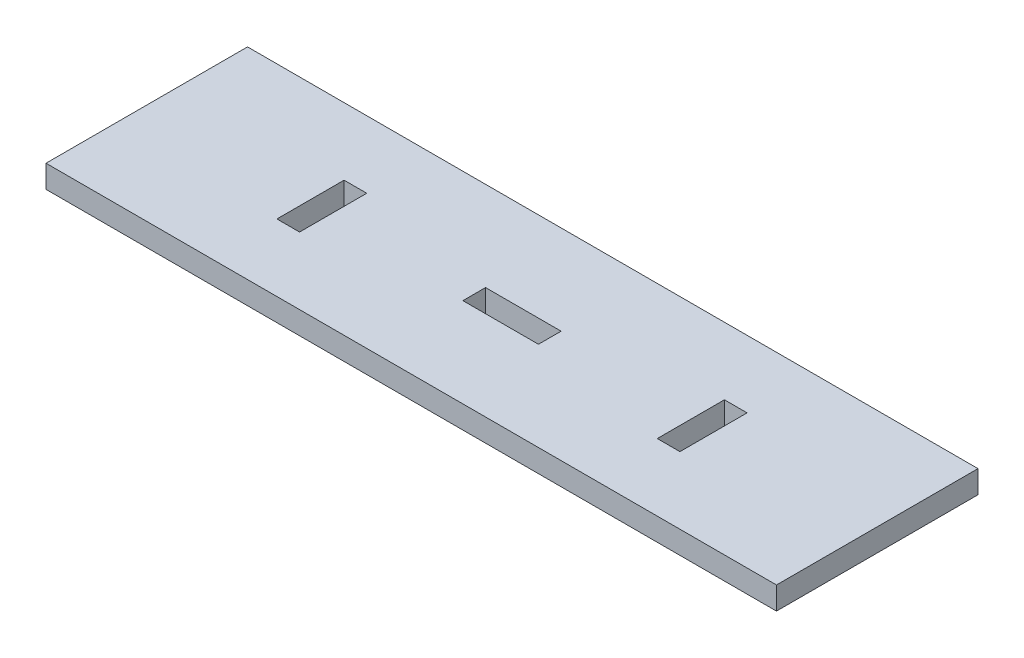
ISO-10303-21;
HEADER;
FILE_DESCRIPTION(('STEP AP214'),'2;1');
FILE_NAME('part.step','',(''),(''),'','','');
FILE_SCHEMA(('AUTOMOTIVE_DESIGN { 1 0 10303 214 1 1 1 1 }'));
ENDSEC;
DATA;
#1=APPLICATION_CONTEXT('core data for automotive mechanical design processes');
#2=APPLICATION_PROTOCOL_DEFINITION('international standard','automotive_design',2000,#1);
#3=PRODUCT_CONTEXT('',#1,'mechanical');
#4=PRODUCT('Part','Part','',(#3));
#5=PRODUCT_RELATED_PRODUCT_CATEGORY('part','',(#4));
#6=PRODUCT_DEFINITION_FORMATION('','',#4);
#7=PRODUCT_DEFINITION_CONTEXT('part definition',#1,'design');
#8=PRODUCT_DEFINITION('design','',#6,#7);
#9=PRODUCT_DEFINITION_SHAPE('','',#8);
#10=(LENGTH_UNIT() NAMED_UNIT(*) SI_UNIT(.MILLI.,.METRE.));
#11=(NAMED_UNIT(*) PLANE_ANGLE_UNIT() SI_UNIT($,.RADIAN.));
#12=(NAMED_UNIT(*) SI_UNIT($,.STERADIAN.) SOLID_ANGLE_UNIT());
#13=UNCERTAINTY_MEASURE_WITH_UNIT(LENGTH_MEASURE(1.E-05),#10,'distance_accuracy_value','');
#14=(GEOMETRIC_REPRESENTATION_CONTEXT(3) GLOBAL_UNCERTAINTY_ASSIGNED_CONTEXT((#13)) GLOBAL_UNIT_ASSIGNED_CONTEXT((#10,
#11,#12)) REPRESENTATION_CONTEXT('',''));
#15=CARTESIAN_POINT('',(0.,0.,0.));
#16=DIRECTION('',(0.,0.,1.));
#17=DIRECTION('',(1.,0.,0.));
#18=AXIS2_PLACEMENT_3D('',#15,#16,#17);
#19=CARTESIAN_POINT('',(0.,8.99999999999999,-44.5));
#20=DIRECTION('',(0.,0.,-1.));
#21=DIRECTION('',(-1.,0.,0.));
#22=AXIS2_PLACEMENT_3D('',#19,#20,#21);
#23=PLANE('',#22);
#24=DIRECTION('',(1.,0.,0.));
#25=VECTOR('',#24,1.);
#26=CARTESIAN_POINT('',(0.,0.,-44.5));
#27=LINE('',#26,#25);
#28=CARTESIAN_POINT('',(130.,0.,-44.5));
#29=VERTEX_POINT('',#28);
#30=CARTESIAN_POINT('',(160.,0.,-44.5));
#31=VERTEX_POINT('',#30);
#32=EDGE_CURVE('E239',#29,#31,#27,.T.);
#33=ORIENTED_EDGE('',*,*,#32,.T.);
#34=DIRECTION('',(0.,-1.,0.));
#35=VECTOR('',#34,1.);
#36=CARTESIAN_POINT('',(160.,8.99999999999999,-44.5));
#37=LINE('',#36,#35);
#38=CARTESIAN_POINT('',(160.,8.99999999999999,-44.5));
#39=VERTEX_POINT('',#38);
#40=EDGE_CURVE('E11',#39,#31,#37,.T.);
#41=ORIENTED_EDGE('',*,*,#40,.F.);
#42=DIRECTION('',(1.,0.,0.));
#43=VECTOR('',#42,1.);
#44=CARTESIAN_POINT('',(0.,8.99999999999999,-44.5));
#45=LINE('',#44,#43);
#46=CARTESIAN_POINT('',(130.,8.99999999999999,-44.5));
#47=VERTEX_POINT('',#46);
#48=EDGE_CURVE('E171',#47,#39,#45,.T.);
#49=ORIENTED_EDGE('',*,*,#48,.F.);
#50=DIRECTION('',(0.,-1.,0.));
#51=VECTOR('',#50,1.);
#52=CARTESIAN_POINT('',(130.,8.99999999999999,-44.5));
#53=LINE('',#52,#51);
#54=EDGE_CURVE('E62',#47,#29,#53,.T.);
#55=ORIENTED_EDGE('',*,*,#54,.T.);
#56=EDGE_LOOP('',(#33,#41,#49,#55));
#57=FACE_BOUND('',#56,.T.);
#58=ADVANCED_FACE('F42',(#57),#23,.F.);
#59=CARTESIAN_POINT('',(160.,8.99999999999999,0.));
#60=DIRECTION('',(1.,0.,0.));
#61=DIRECTION('',(0.,0.,-1.));
#62=AXIS2_PLACEMENT_3D('',#59,#60,#61);
#63=PLANE('',#62);
#64=DIRECTION('',(0.,0.,1.));
#65=VECTOR('',#64,1.);
#66=CARTESIAN_POINT('',(160.,0.,0.));
#67=LINE('',#66,#65);
#68=CARTESIAN_POINT('',(160.,0.,-35.5));
#69=VERTEX_POINT('',#68);
#70=EDGE_CURVE('E178',#31,#69,#67,.T.);
#71=ORIENTED_EDGE('',*,*,#70,.T.);
#72=DIRECTION('',(0.,-1.,0.));
#73=VECTOR('',#72,1.);
#74=CARTESIAN_POINT('',(160.,8.99999999999999,-35.5));
#75=LINE('',#74,#73);
#76=CARTESIAN_POINT('',(160.,8.99999999999999,-35.5));
#77=VERTEX_POINT('',#76);
#78=EDGE_CURVE('E53',#77,#69,#75,.T.);
#79=ORIENTED_EDGE('',*,*,#78,.F.);
#80=DIRECTION('',(0.,0.,1.));
#81=VECTOR('',#80,1.);
#82=CARTESIAN_POINT('',(160.,8.99999999999999,0.));
#83=LINE('',#82,#81);
#84=EDGE_CURVE('E165',#39,#77,#83,.T.);
#85=ORIENTED_EDGE('',*,*,#84,.F.);
#86=ORIENTED_EDGE('',*,*,#40,.T.);
#87=EDGE_LOOP('',(#71,#79,#85,#86));
#88=FACE_BOUND('',#87,.T.);
#89=ADVANCED_FACE('F177',(#88),#63,.F.);
#90=CARTESIAN_POINT('',(0.,8.99999999999999,-35.5));
#91=DIRECTION('',(0.,0.,-1.));
#92=DIRECTION('',(-1.,0.,0.));
#93=AXIS2_PLACEMENT_3D('',#90,#91,#92);
#94=PLANE('',#93);
#95=DIRECTION('',(1.,0.,0.));
#96=VECTOR('',#95,1.);
#97=CARTESIAN_POINT('',(0.,0.,-35.5));
#98=LINE('',#97,#96);
#99=CARTESIAN_POINT('',(130.,0.,-35.5));
#100=VERTEX_POINT('',#99);
#101=EDGE_CURVE('E244',#100,#69,#98,.T.);
#102=ORIENTED_EDGE('',*,*,#101,.F.);
#103=DIRECTION('',(0.,-1.,0.));
#104=VECTOR('',#103,1.);
#105=CARTESIAN_POINT('',(130.,8.99999999999999,-35.5));
#106=LINE('',#105,#104);
#107=CARTESIAN_POINT('',(130.,8.99999999999999,-35.5));
#108=VERTEX_POINT('',#107);
#109=EDGE_CURVE('E112',#108,#100,#106,.T.);
#110=ORIENTED_EDGE('',*,*,#109,.F.);
#111=DIRECTION('',(1.,0.,0.));
#112=VECTOR('',#111,1.);
#113=CARTESIAN_POINT('',(0.,8.99999999999999,-35.5));
#114=LINE('',#113,#112);
#115=EDGE_CURVE('E170',#108,#77,#114,.T.);
#116=ORIENTED_EDGE('',*,*,#115,.T.);
#117=ORIENTED_EDGE('',*,*,#78,.T.);
#118=EDGE_LOOP('',(#102,#110,#116,#117));
#119=FACE_BOUND('',#118,.T.);
#120=ADVANCED_FACE('F183',(#119),#94,.T.);
#121=CARTESIAN_POINT('',(0.,8.99999999999999,-26.6666666666667));
#122=DIRECTION('',(0.,0.,1.));
#123=DIRECTION('',(1.,0.,0.));
#124=AXIS2_PLACEMENT_3D('',#121,#122,#123);
#125=PLANE('',#124);
#126=DIRECTION('',(-1.,0.,0.));
#127=VECTOR('',#126,1.);
#128=CARTESIAN_POINT('',(0.,0.,-26.6666666666667));
#129=LINE('',#128,#127);
#130=CARTESIAN_POINT('',(74.,0.,-26.6666666666667));
#131=VERTEX_POINT('',#130);
#132=CARTESIAN_POINT('',(65.,0.,-26.6666666666667));
#133=VERTEX_POINT('',#132);
#134=EDGE_CURVE('E225',#131,#133,#129,.T.);
#135=ORIENTED_EDGE('',*,*,#134,.T.);
#136=DIRECTION('',(0.,-1.,0.));
#137=VECTOR('',#136,1.);
#138=CARTESIAN_POINT('',(65.,8.99999999999999,-26.6666666666667));
#139=LINE('',#138,#137);
#140=CARTESIAN_POINT('',(65.,8.99999999999999,-26.6666666666667));
#141=VERTEX_POINT('',#140);
#142=EDGE_CURVE('E254',#141,#133,#139,.T.);
#143=ORIENTED_EDGE('',*,*,#142,.F.);
#144=DIRECTION('',(-1.,0.,0.));
#145=VECTOR('',#144,1.);
#146=CARTESIAN_POINT('',(0.,8.99999999999999,-26.6666666666667));
#147=LINE('',#146,#145);
#148=CARTESIAN_POINT('',(74.,8.99999999999999,-26.6666666666667));
#149=VERTEX_POINT('',#148);
#150=EDGE_CURVE('E532',#149,#141,#147,.T.);
#151=ORIENTED_EDGE('',*,*,#150,.F.);
#152=DIRECTION('',(0.,-1.,0.));
#153=VECTOR('',#152,1.);
#154=CARTESIAN_POINT('',(74.,8.99999999999999,-26.6666666666667));
#155=LINE('',#154,#153);
#156=EDGE_CURVE('E257',#149,#131,#155,.T.);
#157=ORIENTED_EDGE('',*,*,#156,.T.);
#158=EDGE_LOOP('',(#135,#143,#151,#157));
#159=FACE_BOUND('',#158,.T.);
#160=ADVANCED_FACE('F337',(#159),#125,.F.);
#161=CARTESIAN_POINT('',(65.,8.99999999999999,0.));
#162=DIRECTION('',(1.,0.,0.));
#163=DIRECTION('',(0.,0.,-1.));
#164=AXIS2_PLACEMENT_3D('',#161,#162,#163);
#165=PLANE('',#164);
#166=DIRECTION('',(0.,0.,1.));
#167=VECTOR('',#166,1.);
#168=CARTESIAN_POINT('',(65.,0.,0.));
#169=LINE('',#168,#167);
#170=CARTESIAN_POINT('',(65.,0.,-53.3333333333333));
#171=VERTEX_POINT('',#170);
#172=EDGE_CURVE('E229',#171,#133,#169,.T.);
#173=ORIENTED_EDGE('',*,*,#172,.F.);
#174=DIRECTION('',(0.,-1.,0.));
#175=VECTOR('',#174,1.);
#176=CARTESIAN_POINT('',(65.,8.99999999999999,-53.3333333333333));
#177=LINE('',#176,#175);
#178=CARTESIAN_POINT('',(65.,8.99999999999999,-53.3333333333333));
#179=VERTEX_POINT('',#178);
#180=EDGE_CURVE('E266',#179,#171,#177,.T.);
#181=ORIENTED_EDGE('',*,*,#180,.F.);
#182=DIRECTION('',(0.,0.,1.));
#183=VECTOR('',#182,1.);
#184=CARTESIAN_POINT('',(65.,8.99999999999999,0.));
#185=LINE('',#184,#183);
#186=EDGE_CURVE('E528',#179,#141,#185,.T.);
#187=ORIENTED_EDGE('',*,*,#186,.T.);
#188=ORIENTED_EDGE('',*,*,#142,.T.);
#189=EDGE_LOOP('',(#173,#181,#187,#188));
#190=FACE_BOUND('',#189,.T.);
#191=ADVANCED_FACE('F333',(#190),#165,.T.);
#192=CARTESIAN_POINT('',(0.,8.99999999999999,-53.3333333333333));
#193=DIRECTION('',(0.,0.,-1.));
#194=DIRECTION('',(-1.,0.,0.));
#195=AXIS2_PLACEMENT_3D('',#192,#193,#194);
#196=PLANE('',#195);
#197=DIRECTION('',(1.,0.,0.));
#198=VECTOR('',#197,1.);
#199=CARTESIAN_POINT('',(0.,0.,-53.3333333333333));
#200=LINE('',#199,#198);
#201=CARTESIAN_POINT('',(74.,0.,-53.3333333333333));
#202=VERTEX_POINT('',#201);
#203=EDGE_CURVE('E233',#171,#202,#200,.T.);
#204=ORIENTED_EDGE('',*,*,#203,.T.);
#205=DIRECTION('',(0.,-1.,0.));
#206=VECTOR('',#205,1.);
#207=CARTESIAN_POINT('',(74.,8.99999999999999,-53.3333333333333));
#208=LINE('',#207,#206);
#209=CARTESIAN_POINT('',(74.,8.99999999999999,-53.3333333333333));
#210=VERTEX_POINT('',#209);
#211=EDGE_CURVE('E261',#210,#202,#208,.T.);
#212=ORIENTED_EDGE('',*,*,#211,.F.);
#213=DIRECTION('',(1.,0.,0.));
#214=VECTOR('',#213,1.);
#215=CARTESIAN_POINT('',(0.,8.99999999999999,-53.3333333333333));
#216=LINE('',#215,#214);
#217=EDGE_CURVE('E523',#179,#210,#216,.T.);
#218=ORIENTED_EDGE('',*,*,#217,.F.);
#219=ORIENTED_EDGE('',*,*,#180,.T.);
#220=EDGE_LOOP('',(#204,#212,#218,#219));
#221=FACE_BOUND('',#220,.T.);
#222=ADVANCED_FACE('F329',(#221),#196,.F.);
#223=CARTESIAN_POINT('',(225.,8.99999999999999,0.));
#224=DIRECTION('',(1.,0.,0.));
#225=DIRECTION('',(0.,0.,-1.));
#226=AXIS2_PLACEMENT_3D('',#223,#224,#225);
#227=PLANE('',#226);
#228=DIRECTION('',(0.,0.,1.));
#229=VECTOR('',#228,1.);
#230=CARTESIAN_POINT('',(225.,0.,0.));
#231=LINE('',#230,#229);
#232=CARTESIAN_POINT('',(225.,0.,-53.3333333333333));
#233=VERTEX_POINT('',#232);
#234=CARTESIAN_POINT('',(225.,0.,-26.6666666666667));
#235=VERTEX_POINT('',#234);
#236=EDGE_CURVE('E209',#233,#235,#231,.T.);
#237=ORIENTED_EDGE('',*,*,#236,.T.);
#238=DIRECTION('',(0.,-1.,0.));
#239=VECTOR('',#238,1.);
#240=CARTESIAN_POINT('',(225.,8.99999999999999,-26.6666666666667));
#241=LINE('',#240,#239);
#242=CARTESIAN_POINT('',(225.,8.99999999999999,-26.6666666666667));
#243=VERTEX_POINT('',#242);
#244=EDGE_CURVE('E262',#243,#235,#241,.T.);
#245=ORIENTED_EDGE('',*,*,#244,.F.);
#246=DIRECTION('',(0.,0.,1.));
#247=VECTOR('',#246,1.);
#248=CARTESIAN_POINT('',(225.,8.99999999999999,0.));
#249=LINE('',#248,#247);
#250=CARTESIAN_POINT('',(225.,8.99999999999999,-53.3333333333333));
#251=VERTEX_POINT('',#250);
#252=EDGE_CURVE('E547',#251,#243,#249,.T.);
#253=ORIENTED_EDGE('',*,*,#252,.F.);
#254=DIRECTION('',(0.,-1.,0.));
#255=VECTOR('',#254,1.);
#256=CARTESIAN_POINT('',(225.,8.99999999999999,-53.3333333333333));
#257=LINE('',#256,#255);
#258=EDGE_CURVE('E271',#251,#233,#257,.T.);
#259=ORIENTED_EDGE('',*,*,#258,.T.);
#260=EDGE_LOOP('',(#237,#245,#253,#259));
#261=FACE_BOUND('',#260,.T.);
#262=ADVANCED_FACE('F332',(#261),#227,.F.);
#263=CARTESIAN_POINT('',(0.,8.99999999999999,-26.6666666666667));
#264=DIRECTION('',(0.,0.,-1.));
#265=DIRECTION('',(-1.,0.,0.));
#266=AXIS2_PLACEMENT_3D('',#263,#264,#265);
#267=PLANE('',#266);
#268=DIRECTION('',(1.,0.,0.));
#269=VECTOR('',#268,1.);
#270=CARTESIAN_POINT('',(0.,0.,-26.6666666666667));
#271=LINE('',#270,#269);
#272=CARTESIAN_POINT('',(216.,0.,-26.6666666666667));
#273=VERTEX_POINT('',#272);
#274=EDGE_CURVE('E213',#273,#235,#271,.T.);
#275=ORIENTED_EDGE('',*,*,#274,.F.);
#276=DIRECTION('',(0.,-1.,0.));
#277=VECTOR('',#276,1.);
#278=CARTESIAN_POINT('',(216.,8.99999999999999,-26.6666666666667));
#279=LINE('',#278,#277);
#280=CARTESIAN_POINT('',(216.,8.99999999999999,-26.6666666666667));
#281=VERTEX_POINT('',#280);
#282=EDGE_CURVE('E277',#281,#273,#279,.T.);
#283=ORIENTED_EDGE('',*,*,#282,.F.);
#284=DIRECTION('',(1.,0.,0.));
#285=VECTOR('',#284,1.);
#286=CARTESIAN_POINT('',(0.,8.99999999999999,-26.6666666666667));
#287=LINE('',#286,#285);
#288=EDGE_CURVE('E543',#281,#243,#287,.T.);
#289=ORIENTED_EDGE('',*,*,#288,.T.);
#290=ORIENTED_EDGE('',*,*,#244,.T.);
#291=EDGE_LOOP('',(#275,#283,#289,#290));
#292=FACE_BOUND('',#291,.T.);
#293=ADVANCED_FACE('F348',(#292),#267,.T.);
#294=CARTESIAN_POINT('',(216.,8.99999999999999,0.));
#295=DIRECTION('',(1.,0.,0.));
#296=DIRECTION('',(0.,0.,-1.));
#297=AXIS2_PLACEMENT_3D('',#294,#295,#296);
#298=PLANE('',#297);
#299=DIRECTION('',(0.,0.,1.));
#300=VECTOR('',#299,1.);
#301=CARTESIAN_POINT('',(216.,0.,0.));
#302=LINE('',#301,#300);
#303=CARTESIAN_POINT('',(216.,0.,-53.3333333333333));
#304=VERTEX_POINT('',#303);
#305=EDGE_CURVE('E217',#304,#273,#302,.T.);
#306=ORIENTED_EDGE('',*,*,#305,.F.);
#307=DIRECTION('',(0.,-1.,0.));
#308=VECTOR('',#307,1.);
#309=CARTESIAN_POINT('',(216.,8.99999999999999,-53.3333333333333));
#310=LINE('',#309,#308);
#311=CARTESIAN_POINT('',(216.,8.99999999999999,-53.3333333333333));
#312=VERTEX_POINT('',#311);
#313=EDGE_CURVE('E274',#312,#304,#310,.T.);
#314=ORIENTED_EDGE('',*,*,#313,.F.);
#315=DIRECTION('',(0.,0.,1.));
#316=VECTOR('',#315,1.);
#317=CARTESIAN_POINT('',(216.,8.99999999999999,0.));
#318=LINE('',#317,#316);
#319=EDGE_CURVE('E539',#312,#281,#318,.T.);
#320=ORIENTED_EDGE('',*,*,#319,.T.);
#321=ORIENTED_EDGE('',*,*,#282,.T.);
#322=EDGE_LOOP('',(#306,#314,#320,#321));
#323=FACE_BOUND('',#322,.T.);
#324=ADVANCED_FACE('F345',(#323),#298,.T.);
#325=CARTESIAN_POINT('',(0.,8.99999999999999,0.));
#326=DIRECTION('',(0.,0.,-1.));
#327=DIRECTION('',(-1.,0.,0.));
#328=AXIS2_PLACEMENT_3D('',#325,#326,#327);
#329=PLANE('',#328);
#330=DIRECTION('',(1.,0.,0.));
#331=VECTOR('',#330,1.);
#332=CARTESIAN_POINT('',(0.,0.,0.));
#333=LINE('',#332,#331);
#334=CARTESIAN_POINT('',(0.,0.,0.));
#335=VERTEX_POINT('',#334);
#336=CARTESIAN_POINT('',(290.,0.,0.));
#337=VERTEX_POINT('',#336);
#338=EDGE_CURVE('E193',#335,#337,#333,.T.);
#339=ORIENTED_EDGE('',*,*,#338,.T.);
#340=DIRECTION('',(0.,-1.,0.));
#341=VECTOR('',#340,1.);
#342=CARTESIAN_POINT('',(290.,8.99999999999999,0.));
#343=LINE('',#342,#341);
#344=CARTESIAN_POINT('',(290.,8.99999999999999,0.));
#345=VERTEX_POINT('',#344);
#346=EDGE_CURVE('E46',#345,#337,#343,.T.);
#347=ORIENTED_EDGE('',*,*,#346,.F.);
#348=DIRECTION('',(1.,0.,0.));
#349=VECTOR('',#348,1.);
#350=CARTESIAN_POINT('',(0.,8.99999999999999,0.));
#351=LINE('',#350,#349);
#352=CARTESIAN_POINT('',(0.,8.99999999999999,0.));
#353=VERTEX_POINT('',#352);
#354=EDGE_CURVE('E251',#353,#345,#351,.T.);
#355=ORIENTED_EDGE('',*,*,#354,.F.);
#356=DIRECTION('',(0.,-1.,0.));
#357=VECTOR('',#356,1.);
#358=CARTESIAN_POINT('',(0.,8.99999999999999,0.));
#359=LINE('',#358,#357);
#360=EDGE_CURVE('E189',#353,#335,#359,.T.);
#361=ORIENTED_EDGE('',*,*,#360,.T.);
#362=EDGE_LOOP('',(#339,#347,#355,#361));
#363=FACE_BOUND('',#362,.T.);
#364=ADVANCED_FACE('F44',(#363),#329,.F.);
#365=CARTESIAN_POINT('',(290.,8.99999999999999,0.));
#366=DIRECTION('',(-1.,0.,0.));
#367=DIRECTION('',(0.,0.,1.));
#368=AXIS2_PLACEMENT_3D('',#365,#366,#367);
#369=PLANE('',#368);
#370=DIRECTION('',(0.,0.,-1.));
#371=VECTOR('',#370,1.);
#372=CARTESIAN_POINT('',(290.,0.,0.));
#373=LINE('',#372,#371);
#374=CARTESIAN_POINT('',(290.,0.,-80.));
#375=VERTEX_POINT('',#374);
#376=EDGE_CURVE('E197',#337,#375,#373,.T.);
#377=ORIENTED_EDGE('',*,*,#376,.T.);
#378=DIRECTION('',(0.,-1.,0.));
#379=VECTOR('',#378,1.);
#380=CARTESIAN_POINT('',(290.,8.99999999999999,-80.));
#381=LINE('',#380,#379);
#382=CARTESIAN_POINT('',(290.,8.99999999999999,-80.));
#383=VERTEX_POINT('',#382);
#384=EDGE_CURVE('E286',#383,#375,#381,.T.);
#385=ORIENTED_EDGE('',*,*,#384,.F.);
#386=DIRECTION('',(0.,0.,-1.));
#387=VECTOR('',#386,1.);
#388=CARTESIAN_POINT('',(290.,8.99999999999999,0.));
#389=LINE('',#388,#387);
#390=EDGE_CURVE('E125',#345,#383,#389,.T.);
#391=ORIENTED_EDGE('',*,*,#390,.F.);
#392=ORIENTED_EDGE('',*,*,#346,.T.);
#393=EDGE_LOOP('',(#377,#385,#391,#392));
#394=FACE_BOUND('',#393,.T.);
#395=ADVANCED_FACE('F295',(#394),#369,.F.);
#396=CARTESIAN_POINT('',(0.,8.99999999999999,-80.));
#397=DIRECTION('',(0.,0.,-1.));
#398=DIRECTION('',(-1.,0.,0.));
#399=AXIS2_PLACEMENT_3D('',#396,#397,#398);
#400=PLANE('',#399);
#401=DIRECTION('',(1.,0.,0.));
#402=VECTOR('',#401,1.);
#403=CARTESIAN_POINT('',(0.,0.,-80.));
#404=LINE('',#403,#402);
#405=CARTESIAN_POINT('',(0.,0.,-80.));
#406=VERTEX_POINT('',#405);
#407=EDGE_CURVE('E201',#406,#375,#404,.T.);
#408=ORIENTED_EDGE('',*,*,#407,.F.);
#409=DIRECTION('',(0.,-1.,0.));
#410=VECTOR('',#409,1.);
#411=CARTESIAN_POINT('',(0.,8.99999999999999,-80.));
#412=LINE('',#411,#410);
#413=CARTESIAN_POINT('',(0.,8.99999999999999,-80.));
#414=VERTEX_POINT('',#413);
#415=EDGE_CURVE('E284',#414,#406,#412,.T.);
#416=ORIENTED_EDGE('',*,*,#415,.F.);
#417=DIRECTION('',(1.,0.,0.));
#418=VECTOR('',#417,1.);
#419=CARTESIAN_POINT('',(0.,8.99999999999999,-80.));
#420=LINE('',#419,#418);
#421=EDGE_CURVE('E552',#414,#383,#420,.T.);
#422=ORIENTED_EDGE('',*,*,#421,.T.);
#423=ORIENTED_EDGE('',*,*,#384,.T.);
#424=EDGE_LOOP('',(#408,#416,#422,#423));
#425=FACE_BOUND('',#424,.T.);
#426=ADVANCED_FACE('F309',(#425),#400,.T.);
#427=CARTESIAN_POINT('',(74.,8.99999999999999,0.));
#428=DIRECTION('',(1.,0.,0.));
#429=DIRECTION('',(0.,0.,-1.));
#430=AXIS2_PLACEMENT_3D('',#427,#428,#429);
#431=PLANE('',#430);
#432=DIRECTION('',(0.,0.,1.));
#433=VECTOR('',#432,1.);
#434=CARTESIAN_POINT('',(74.,0.,0.));
#435=LINE('',#434,#433);
#436=EDGE_CURVE('E236',#202,#131,#435,.T.);
#437=ORIENTED_EDGE('',*,*,#436,.T.);
#438=ORIENTED_EDGE('',*,*,#156,.F.);
#439=DIRECTION('',(0.,0.,1.));
#440=VECTOR('',#439,1.);
#441=CARTESIAN_POINT('',(74.,8.99999999999999,0.));
#442=LINE('',#441,#440);
#443=EDGE_CURVE('E520',#210,#149,#442,.T.);
#444=ORIENTED_EDGE('',*,*,#443,.F.);
#445=ORIENTED_EDGE('',*,*,#211,.T.);
#446=EDGE_LOOP('',(#437,#438,#444,#445));
#447=FACE_BOUND('',#446,.T.);
#448=ADVANCED_FACE('F311',(#447),#431,.F.);
#449=CARTESIAN_POINT('',(0.,8.99999999999999,-53.3333333333333));
#450=DIRECTION('',(0.,0.,1.));
#451=DIRECTION('',(1.,0.,0.));
#452=AXIS2_PLACEMENT_3D('',#449,#450,#451);
#453=PLANE('',#452);
#454=DIRECTION('',(-1.,0.,0.));
#455=VECTOR('',#454,1.);
#456=CARTESIAN_POINT('',(0.,0.,-53.3333333333333));
#457=LINE('',#456,#455);
#458=EDGE_CURVE('E221',#233,#304,#457,.T.);
#459=ORIENTED_EDGE('',*,*,#458,.F.);
#460=ORIENTED_EDGE('',*,*,#258,.F.);
#461=DIRECTION('',(-1.,0.,0.));
#462=VECTOR('',#461,1.);
#463=CARTESIAN_POINT('',(0.,8.99999999999999,-53.3333333333333));
#464=LINE('',#463,#462);
#465=EDGE_CURVE('E535',#251,#312,#464,.T.);
#466=ORIENTED_EDGE('',*,*,#465,.T.);
#467=ORIENTED_EDGE('',*,*,#313,.T.);
#468=EDGE_LOOP('',(#459,#460,#466,#467));
#469=FACE_BOUND('',#468,.T.);
#470=ADVANCED_FACE('F317',(#469),#453,.T.);
#471=CARTESIAN_POINT('',(0.,8.99999999999999,0.));
#472=DIRECTION('',(-1.,0.,0.));
#473=DIRECTION('',(0.,0.,1.));
#474=AXIS2_PLACEMENT_3D('',#471,#472,#473);
#475=PLANE('',#474);
#476=DIRECTION('',(0.,0.,-1.));
#477=VECTOR('',#476,1.);
#478=CARTESIAN_POINT('',(0.,0.,0.));
#479=LINE('',#478,#477);
#480=EDGE_CURVE('E205',#335,#406,#479,.T.);
#481=ORIENTED_EDGE('',*,*,#480,.F.);
#482=ORIENTED_EDGE('',*,*,#360,.F.);
#483=DIRECTION('',(0.,0.,-1.));
#484=VECTOR('',#483,1.);
#485=CARTESIAN_POINT('',(0.,8.99999999999999,0.));
#486=LINE('',#485,#484);
#487=EDGE_CURVE('E307',#353,#414,#486,.T.);
#488=ORIENTED_EDGE('',*,*,#487,.T.);
#489=ORIENTED_EDGE('',*,*,#415,.T.);
#490=EDGE_LOOP('',(#481,#482,#488,#489));
#491=FACE_BOUND('',#490,.T.);
#492=ADVANCED_FACE('F304',(#491),#475,.T.);
#493=CARTESIAN_POINT('',(130.,8.99999999999999,0.));
#494=DIRECTION('',(1.,0.,0.));
#495=DIRECTION('',(0.,0.,-1.));
#496=AXIS2_PLACEMENT_3D('',#493,#494,#495);
#497=PLANE('',#496);
#498=DIRECTION('',(0.,0.,1.));
#499=VECTOR('',#498,1.);
#500=CARTESIAN_POINT('',(130.,0.,0.));
#501=LINE('',#500,#499);
#502=EDGE_CURVE('E247',#29,#100,#501,.T.);
#503=ORIENTED_EDGE('',*,*,#502,.F.);
#504=ORIENTED_EDGE('',*,*,#54,.F.);
#505=DIRECTION('',(0.,0.,1.));
#506=VECTOR('',#505,1.);
#507=CARTESIAN_POINT('',(130.,8.99999999999999,0.));
#508=LINE('',#507,#506);
#509=EDGE_CURVE('E185',#47,#108,#508,.T.);
#510=ORIENTED_EDGE('',*,*,#509,.T.);
#511=ORIENTED_EDGE('',*,*,#109,.T.);
#512=EDGE_LOOP('',(#503,#504,#510,#511));
#513=FACE_BOUND('',#512,.T.);
#514=ADVANCED_FACE('F356',(#513),#497,.T.);
#515=CARTESIAN_POINT('',(0.,8.99999999999999,0.));
#516=DIRECTION('',(0.,1.,0.));
#517=DIRECTION('',(0.,0.,1.));
#518=AXIS2_PLACEMENT_3D('',#515,#516,#517);
#519=PLANE('',#518);
#520=ORIENTED_EDGE('',*,*,#354,.T.);
#521=ORIENTED_EDGE('',*,*,#390,.T.);
#522=ORIENTED_EDGE('',*,*,#421,.F.);
#523=ORIENTED_EDGE('',*,*,#487,.F.);
#524=EDGE_LOOP('',(#520,#521,#522,#523));
#525=FACE_BOUND('',#524,.T.);
#526=ORIENTED_EDGE('',*,*,#252,.T.);
#527=ORIENTED_EDGE('',*,*,#288,.F.);
#528=ORIENTED_EDGE('',*,*,#319,.F.);
#529=ORIENTED_EDGE('',*,*,#465,.F.);
#530=EDGE_LOOP('',(#526,#527,#528,#529));
#531=FACE_BOUND('',#530,.T.);
#532=ORIENTED_EDGE('',*,*,#150,.T.);
#533=ORIENTED_EDGE('',*,*,#186,.F.);
#534=ORIENTED_EDGE('',*,*,#217,.T.);
#535=ORIENTED_EDGE('',*,*,#443,.T.);
#536=EDGE_LOOP('',(#532,#533,#534,#535));
#537=FACE_BOUND('',#536,.T.);
#538=ORIENTED_EDGE('',*,*,#48,.T.);
#539=ORIENTED_EDGE('',*,*,#84,.T.);
#540=ORIENTED_EDGE('',*,*,#115,.F.);
#541=ORIENTED_EDGE('',*,*,#509,.F.);
#542=EDGE_LOOP('',(#538,#539,#540,#541));
#543=FACE_BOUND('',#542,.T.);
#544=ADVANCED_FACE('F167',(#525,#531,#537,#543),#519,.T.);
#545=CARTESIAN_POINT('',(0.,0.,0.));
#546=DIRECTION('',(0.,1.,0.));
#547=DIRECTION('',(0.,0.,1.));
#548=AXIS2_PLACEMENT_3D('',#545,#546,#547);
#549=PLANE('',#548);
#550=ORIENTED_EDGE('',*,*,#338,.F.);
#551=ORIENTED_EDGE('',*,*,#480,.T.);
#552=ORIENTED_EDGE('',*,*,#407,.T.);
#553=ORIENTED_EDGE('',*,*,#376,.F.);
#554=EDGE_LOOP('',(#550,#551,#552,#553));
#555=FACE_BOUND('',#554,.T.);
#556=ORIENTED_EDGE('',*,*,#236,.F.);
#557=ORIENTED_EDGE('',*,*,#458,.T.);
#558=ORIENTED_EDGE('',*,*,#305,.T.);
#559=ORIENTED_EDGE('',*,*,#274,.T.);
#560=EDGE_LOOP('',(#556,#557,#558,#559));
#561=FACE_BOUND('',#560,.T.);
#562=ORIENTED_EDGE('',*,*,#134,.F.);
#563=ORIENTED_EDGE('',*,*,#436,.F.);
#564=ORIENTED_EDGE('',*,*,#203,.F.);
#565=ORIENTED_EDGE('',*,*,#172,.T.);
#566=EDGE_LOOP('',(#562,#563,#564,#565));
#567=FACE_BOUND('',#566,.T.);
#568=ORIENTED_EDGE('',*,*,#32,.F.);
#569=ORIENTED_EDGE('',*,*,#502,.T.);
#570=ORIENTED_EDGE('',*,*,#101,.T.);
#571=ORIENTED_EDGE('',*,*,#70,.F.);
#572=EDGE_LOOP('',(#568,#569,#570,#571));
#573=FACE_BOUND('',#572,.T.);
#574=ADVANCED_FACE('F301',(#555,#561,#567,#573),#549,.F.);
#575=CLOSED_SHELL('',(#58,#89,#120,#160,#191,#222,#262,#293,#324,#364,#395,#426,#448,#470,#492,
#514,#544,#574));
#576=MANIFOLD_SOLID_BREP('B2',#575);
#577=ADVANCED_BREP_SHAPE_REPRESENTATION('',(#18,#576),#14);
#578=SHAPE_DEFINITION_REPRESENTATION(#9,#577);
ENDSEC;
END-ISO-10303-21;
